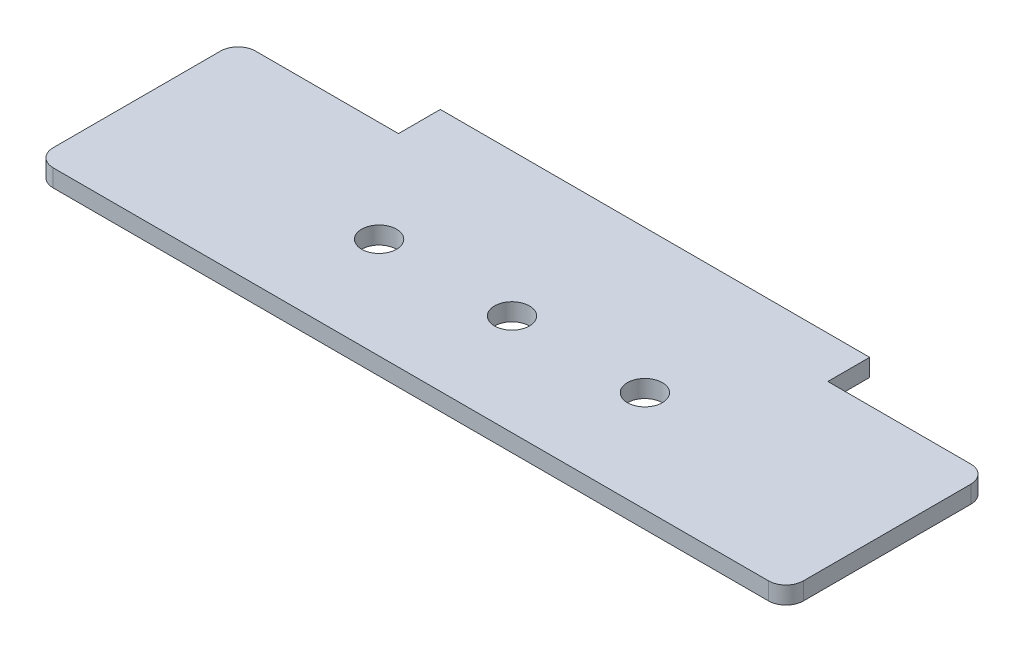
ISO-10303-21;
HEADER;
FILE_DESCRIPTION(('STEP AP214'),'2;1');
FILE_NAME('part.step','',(''),(''),'','','');
FILE_SCHEMA(('AUTOMOTIVE_DESIGN { 1 0 10303 214 1 1 1 1 }'));
ENDSEC;
DATA;
#1=APPLICATION_CONTEXT('core data for automotive mechanical design processes');
#2=APPLICATION_PROTOCOL_DEFINITION('international standard','automotive_design',2000,#1);
#3=PRODUCT_CONTEXT('',#1,'mechanical');
#4=PRODUCT('Part','Part','',(#3));
#5=PRODUCT_RELATED_PRODUCT_CATEGORY('part','',(#4));
#6=PRODUCT_DEFINITION_FORMATION('','',#4);
#7=PRODUCT_DEFINITION_CONTEXT('part definition',#1,'design');
#8=PRODUCT_DEFINITION('design','',#6,#7);
#9=PRODUCT_DEFINITION_SHAPE('','',#8);
#10=(LENGTH_UNIT() NAMED_UNIT(*) SI_UNIT(.MILLI.,.METRE.));
#11=(NAMED_UNIT(*) PLANE_ANGLE_UNIT() SI_UNIT($,.RADIAN.));
#12=(NAMED_UNIT(*) SI_UNIT($,.STERADIAN.) SOLID_ANGLE_UNIT());
#13=UNCERTAINTY_MEASURE_WITH_UNIT(LENGTH_MEASURE(1.E-05),#10,'distance_accuracy_value','');
#14=(GEOMETRIC_REPRESENTATION_CONTEXT(3) GLOBAL_UNCERTAINTY_ASSIGNED_CONTEXT((#13)) GLOBAL_UNIT_ASSIGNED_CONTEXT((#10,
#11,#12)) REPRESENTATION_CONTEXT('',''));
#15=CARTESIAN_POINT('',(0.,0.,0.));
#16=DIRECTION('',(0.,0.,1.));
#17=DIRECTION('',(1.,0.,0.));
#18=AXIS2_PLACEMENT_3D('',#15,#16,#17);
#19=CARTESIAN_POINT('',(-6.445,0.5,-2.39999999999999));
#20=DIRECTION('',(0.,1.,0.));
#21=DIRECTION('',(0.,0.,1.));
#22=AXIS2_PLACEMENT_3D('',#19,#20,#21);
#23=PLANE('',#22);
#24=CARTESIAN_POINT('',(3.81,0.5,0.));
#25=DIRECTION('',(0.,1.,0.));
#26=DIRECTION('',(0.,0.,1.));
#27=AXIS2_PLACEMENT_3D('',#24,#25,#26);
#28=CIRCLE('',#27,0.499999999999999);
#29=CARTESIAN_POINT('',(3.81,0.5,0.499999999999999));
#30=VERTEX_POINT('',#29);
#31=EDGE_CURVE('E327',#30,#30,#28,.T.);
#32=ORIENTED_EDGE('',*,*,#31,.F.);
#33=EDGE_LOOP('',(#32));
#34=FACE_BOUND('',#33,.T.);
#35=DIRECTION('',(0.,0.,1.));
#36=VECTOR('',#35,1.);
#37=CARTESIAN_POINT('',(-2.345,0.5,-4.1));
#38=LINE('',#37,#36);
#39=CARTESIAN_POINT('',(-2.345,0.5,-4.1));
#40=VERTEX_POINT('',#39);
#41=CARTESIAN_POINT('',(-2.345,0.5,-2.9));
#42=VERTEX_POINT('',#41);
#43=EDGE_CURVE('E200',#40,#42,#38,.T.);
#44=ORIENTED_EDGE('',*,*,#43,.T.);
#45=DIRECTION('',(-1.,0.,0.));
#46=VECTOR('',#45,1.);
#47=CARTESIAN_POINT('',(-6.445,0.5,-2.89999999999999));
#48=LINE('',#47,#46);
#49=CARTESIAN_POINT('',(-6.445,0.5,-2.89999999999999));
#50=VERTEX_POINT('',#49);
#51=EDGE_CURVE('E112',#42,#50,#48,.T.);
#52=ORIENTED_EDGE('',*,*,#51,.T.);
#53=CARTESIAN_POINT('',(-6.445,0.5,-2.39999999999999));
#54=DIRECTION('',(0.,1.,0.));
#55=DIRECTION('',(0.,0.,1.));
#56=AXIS2_PLACEMENT_3D('',#53,#54,#55);
#57=CIRCLE('',#56,0.5);
#58=CARTESIAN_POINT('',(-6.945,0.5,-2.39999999999999));
#59=VERTEX_POINT('',#58);
#60=EDGE_CURVE('E237',#50,#59,#57,.T.);
#61=ORIENTED_EDGE('',*,*,#60,.T.);
#62=DIRECTION('',(0.,0.,1.));
#63=VECTOR('',#62,1.);
#64=CARTESIAN_POINT('',(-6.945,0.5,-2.39999999999999));
#65=LINE('',#64,#63);
#66=CARTESIAN_POINT('',(-6.945,0.5,2.4));
#67=VERTEX_POINT('',#66);
#68=EDGE_CURVE('E257',#59,#67,#65,.T.);
#69=ORIENTED_EDGE('',*,*,#68,.T.);
#70=CARTESIAN_POINT('',(-6.445,0.5,2.4));
#71=DIRECTION('',(0.,1.,0.));
#72=DIRECTION('',(0.,0.,1.));
#73=AXIS2_PLACEMENT_3D('',#70,#71,#72);
#74=CIRCLE('',#73,0.499999999999999);
#75=CARTESIAN_POINT('',(-6.445,0.5,2.9));
#76=VERTEX_POINT('',#75);
#77=EDGE_CURVE('E253',#67,#76,#74,.T.);
#78=ORIENTED_EDGE('',*,*,#77,.T.);
#79=DIRECTION('',(1.,0.,0.));
#80=VECTOR('',#79,1.);
#81=CARTESIAN_POINT('',(-6.445,0.5,2.9));
#82=LINE('',#81,#80);
#83=CARTESIAN_POINT('',(14.065,0.5,2.9));
#84=VERTEX_POINT('',#83);
#85=EDGE_CURVE('E256',#76,#84,#82,.T.);
#86=ORIENTED_EDGE('',*,*,#85,.T.);
#87=CARTESIAN_POINT('',(14.065,0.5,2.4));
#88=DIRECTION('',(0.,1.,0.));
#89=DIRECTION('',(0.,0.,1.));
#90=AXIS2_PLACEMENT_3D('',#87,#88,#89);
#91=CIRCLE('',#90,0.5);
#92=CARTESIAN_POINT('',(14.565,0.5,2.4));
#93=VERTEX_POINT('',#92);
#94=EDGE_CURVE('E261',#84,#93,#91,.T.);
#95=ORIENTED_EDGE('',*,*,#94,.T.);
#96=DIRECTION('',(0.,0.,-1.));
#97=VECTOR('',#96,1.);
#98=CARTESIAN_POINT('',(14.565,0.5,-2.4));
#99=LINE('',#98,#97);
#100=CARTESIAN_POINT('',(14.565,0.5,-2.4));
#101=VERTEX_POINT('',#100);
#102=EDGE_CURVE('E268',#93,#101,#99,.T.);
#103=ORIENTED_EDGE('',*,*,#102,.T.);
#104=CARTESIAN_POINT('',(14.065,0.5,-2.4));
#105=DIRECTION('',(0.,1.,0.));
#106=DIRECTION('',(0.,0.,-1.));
#107=AXIS2_PLACEMENT_3D('',#104,#105,#106);
#108=CIRCLE('',#107,0.5);
#109=CARTESIAN_POINT('',(14.065,0.5,-2.9));
#110=VERTEX_POINT('',#109);
#111=EDGE_CURVE('E143',#101,#110,#108,.T.);
#112=ORIENTED_EDGE('',*,*,#111,.T.);
#113=DIRECTION('',(-1.,0.,0.));
#114=VECTOR('',#113,1.);
#115=CARTESIAN_POINT('',(9.965,0.5,-2.9));
#116=LINE('',#115,#114);
#117=CARTESIAN_POINT('',(9.965,0.5,-2.9));
#118=VERTEX_POINT('',#117);
#119=EDGE_CURVE('E137',#110,#118,#116,.T.);
#120=ORIENTED_EDGE('',*,*,#119,.T.);
#121=DIRECTION('',(0.,0.,-1.));
#122=VECTOR('',#121,1.);
#123=CARTESIAN_POINT('',(9.965,0.5,-4.1));
#124=LINE('',#123,#122);
#125=CARTESIAN_POINT('',(9.965,0.5,-4.1));
#126=VERTEX_POINT('',#125);
#127=EDGE_CURVE('E141',#118,#126,#124,.T.);
#128=ORIENTED_EDGE('',*,*,#127,.T.);
#129=DIRECTION('',(-1.,0.,0.));
#130=VECTOR('',#129,1.);
#131=CARTESIAN_POINT('',(-2.345,0.5,-4.1));
#132=LINE('',#131,#130);
#133=EDGE_CURVE('E57',#126,#40,#132,.T.);
#134=ORIENTED_EDGE('',*,*,#133,.T.);
#135=EDGE_LOOP('',(#44,#52,#61,#69,#78,#86,#95,#103,#112,#120,#128,#134));
#136=FACE_BOUND('',#135,.T.);
#137=CARTESIAN_POINT('',(0.,0.5,0.));
#138=DIRECTION('',(0.,1.,0.));
#139=DIRECTION('',(0.,0.,1.));
#140=AXIS2_PLACEMENT_3D('',#137,#138,#139);
#141=CIRCLE('',#140,0.499999999999999);
#142=CARTESIAN_POINT('',(0.,0.5,0.499999999999999));
#143=VERTEX_POINT('',#142);
#144=EDGE_CURVE('E170',#143,#143,#141,.T.);
#145=ORIENTED_EDGE('',*,*,#144,.F.);
#146=EDGE_LOOP('',(#145));
#147=FACE_BOUND('',#146,.T.);
#148=CARTESIAN_POINT('',(7.62000000000001,0.5,0.));
#149=DIRECTION('',(0.,1.,0.));
#150=DIRECTION('',(0.,0.,1.));
#151=AXIS2_PLACEMENT_3D('',#148,#149,#150);
#152=CIRCLE('',#151,0.499999999999999);
#153=CARTESIAN_POINT('',(7.62000000000001,0.5,0.499999999999999));
#154=VERTEX_POINT('',#153);
#155=EDGE_CURVE('E316',#154,#154,#152,.T.);
#156=ORIENTED_EDGE('',*,*,#155,.F.);
#157=EDGE_LOOP('',(#156));
#158=FACE_BOUND('',#157,.T.);
#159=ADVANCED_FACE('F39',(#34,#136,#147,#158),#23,.T.);
#160=CARTESIAN_POINT('',(-6.445,0.,-2.39999999999999));
#161=DIRECTION('',(0.,1.,0.));
#162=DIRECTION('',(0.,0.,1.));
#163=AXIS2_PLACEMENT_3D('',#160,#161,#162);
#164=PLANE('',#163);
#165=DIRECTION('',(0.,0.,1.));
#166=VECTOR('',#165,1.);
#167=CARTESIAN_POINT('',(-2.345,0.,-4.1));
#168=LINE('',#167,#166);
#169=CARTESIAN_POINT('',(-2.345,0.,-4.1));
#170=VERTEX_POINT('',#169);
#171=CARTESIAN_POINT('',(-2.345,0.,-2.9));
#172=VERTEX_POINT('',#171);
#173=EDGE_CURVE('E165',#170,#172,#168,.T.);
#174=ORIENTED_EDGE('',*,*,#173,.F.);
#175=DIRECTION('',(-1.,0.,0.));
#176=VECTOR('',#175,1.);
#177=CARTESIAN_POINT('',(-2.345,0.,-4.1));
#178=LINE('',#177,#176);
#179=CARTESIAN_POINT('',(9.965,0.,-4.1));
#180=VERTEX_POINT('',#179);
#181=EDGE_CURVE('E104',#180,#170,#178,.T.);
#182=ORIENTED_EDGE('',*,*,#181,.F.);
#183=DIRECTION('',(0.,0.,-1.));
#184=VECTOR('',#183,1.);
#185=CARTESIAN_POINT('',(9.965,0.,-4.1));
#186=LINE('',#185,#184);
#187=CARTESIAN_POINT('',(9.965,0.,-2.9));
#188=VERTEX_POINT('',#187);
#189=EDGE_CURVE('E98',#188,#180,#186,.T.);
#190=ORIENTED_EDGE('',*,*,#189,.F.);
#191=DIRECTION('',(-1.,0.,0.));
#192=VECTOR('',#191,1.);
#193=CARTESIAN_POINT('',(9.965,0.,-2.9));
#194=LINE('',#193,#192);
#195=CARTESIAN_POINT('',(14.065,0.,-2.9));
#196=VERTEX_POINT('',#195);
#197=EDGE_CURVE('E152',#196,#188,#194,.T.);
#198=ORIENTED_EDGE('',*,*,#197,.F.);
#199=CARTESIAN_POINT('',(14.065,0.,-2.4));
#200=DIRECTION('',(0.,1.,0.));
#201=DIRECTION('',(0.,0.,-1.));
#202=AXIS2_PLACEMENT_3D('',#199,#200,#201);
#203=CIRCLE('',#202,0.5);
#204=CARTESIAN_POINT('',(14.565,0.,-2.4));
#205=VERTEX_POINT('',#204);
#206=EDGE_CURVE('E191',#205,#196,#203,.T.);
#207=ORIENTED_EDGE('',*,*,#206,.F.);
#208=DIRECTION('',(0.,0.,-1.));
#209=VECTOR('',#208,1.);
#210=CARTESIAN_POINT('',(14.565,0.,-2.4));
#211=LINE('',#210,#209);
#212=CARTESIAN_POINT('',(14.565,0.,2.4));
#213=VERTEX_POINT('',#212);
#214=EDGE_CURVE('E188',#213,#205,#211,.T.);
#215=ORIENTED_EDGE('',*,*,#214,.F.);
#216=CARTESIAN_POINT('',(14.065,0.,2.4));
#217=DIRECTION('',(0.,1.,0.));
#218=DIRECTION('',(0.,0.,1.));
#219=AXIS2_PLACEMENT_3D('',#216,#217,#218);
#220=CIRCLE('',#219,0.5);
#221=CARTESIAN_POINT('',(14.065,0.,2.9));
#222=VERTEX_POINT('',#221);
#223=EDGE_CURVE('E185',#222,#213,#220,.T.);
#224=ORIENTED_EDGE('',*,*,#223,.F.);
#225=DIRECTION('',(1.,0.,0.));
#226=VECTOR('',#225,1.);
#227=CARTESIAN_POINT('',(-6.445,0.,2.9));
#228=LINE('',#227,#226);
#229=CARTESIAN_POINT('',(-6.445,0.,2.9));
#230=VERTEX_POINT('',#229);
#231=EDGE_CURVE('E182',#230,#222,#228,.T.);
#232=ORIENTED_EDGE('',*,*,#231,.F.);
#233=CARTESIAN_POINT('',(-6.445,0.,2.4));
#234=DIRECTION('',(0.,1.,0.));
#235=DIRECTION('',(0.,0.,1.));
#236=AXIS2_PLACEMENT_3D('',#233,#234,#235);
#237=CIRCLE('',#236,0.499999999999999);
#238=CARTESIAN_POINT('',(-6.945,0.,2.4));
#239=VERTEX_POINT('',#238);
#240=EDGE_CURVE('E179',#239,#230,#237,.T.);
#241=ORIENTED_EDGE('',*,*,#240,.F.);
#242=DIRECTION('',(0.,0.,1.));
#243=VECTOR('',#242,1.);
#244=CARTESIAN_POINT('',(-6.945,0.,-2.39999999999999));
#245=LINE('',#244,#243);
#246=CARTESIAN_POINT('',(-6.945,0.,-2.39999999999999));
#247=VERTEX_POINT('',#246);
#248=EDGE_CURVE('E176',#247,#239,#245,.T.);
#249=ORIENTED_EDGE('',*,*,#248,.F.);
#250=CARTESIAN_POINT('',(-6.445,0.,-2.39999999999999));
#251=DIRECTION('',(0.,1.,0.));
#252=DIRECTION('',(0.,0.,1.));
#253=AXIS2_PLACEMENT_3D('',#250,#251,#252);
#254=CIRCLE('',#253,0.5);
#255=CARTESIAN_POINT('',(-6.445,0.,-2.89999999999999));
#256=VERTEX_POINT('',#255);
#257=EDGE_CURVE('E173',#256,#247,#254,.T.);
#258=ORIENTED_EDGE('',*,*,#257,.F.);
#259=DIRECTION('',(-1.,0.,0.));
#260=VECTOR('',#259,1.);
#261=CARTESIAN_POINT('',(-6.445,0.,-2.89999999999999));
#262=LINE('',#261,#260);
#263=EDGE_CURVE('E169',#172,#256,#262,.T.);
#264=ORIENTED_EDGE('',*,*,#263,.F.);
#265=EDGE_LOOP('',(#174,#182,#190,#198,#207,#215,#224,#232,#241,#249,#258,#264));
#266=FACE_BOUND('',#265,.T.);
#267=CARTESIAN_POINT('',(0.,0.,0.));
#268=DIRECTION('',(0.,1.,0.));
#269=DIRECTION('',(0.,0.,1.));
#270=AXIS2_PLACEMENT_3D('',#267,#268,#269);
#271=CIRCLE('',#270,0.499999999999999);
#272=CARTESIAN_POINT('',(0.,0.,0.499999999999999));
#273=VERTEX_POINT('',#272);
#274=EDGE_CURVE('E331',#273,#273,#271,.T.);
#275=ORIENTED_EDGE('',*,*,#274,.T.);
#276=EDGE_LOOP('',(#275));
#277=FACE_BOUND('',#276,.T.);
#278=CARTESIAN_POINT('',(3.81,0.,0.));
#279=DIRECTION('',(0.,1.,0.));
#280=DIRECTION('',(0.,0.,1.));
#281=AXIS2_PLACEMENT_3D('',#278,#279,#280);
#282=CIRCLE('',#281,0.499999999999999);
#283=CARTESIAN_POINT('',(3.81,0.,0.499999999999999));
#284=VERTEX_POINT('',#283);
#285=EDGE_CURVE('E324',#284,#284,#282,.T.);
#286=ORIENTED_EDGE('',*,*,#285,.T.);
#287=EDGE_LOOP('',(#286));
#288=FACE_BOUND('',#287,.T.);
#289=CARTESIAN_POINT('',(7.62000000000001,0.,0.));
#290=DIRECTION('',(0.,1.,0.));
#291=DIRECTION('',(0.,0.,1.));
#292=AXIS2_PLACEMENT_3D('',#289,#290,#291);
#293=CIRCLE('',#292,0.499999999999999);
#294=CARTESIAN_POINT('',(7.62000000000001,0.,0.499999999999999));
#295=VERTEX_POINT('',#294);
#296=EDGE_CURVE('E319',#295,#295,#293,.T.);
#297=ORIENTED_EDGE('',*,*,#296,.T.);
#298=EDGE_LOOP('',(#297));
#299=FACE_BOUND('',#298,.T.);
#300=ADVANCED_FACE('F241',(#266,#277,#288,#299),#164,.F.);
#301=CARTESIAN_POINT('',(-2.345,0.5,-4.1));
#302=DIRECTION('',(1.,0.,0.));
#303=DIRECTION('',(0.,0.,-1.));
#304=AXIS2_PLACEMENT_3D('',#301,#302,#303);
#305=PLANE('',#304);
#306=ORIENTED_EDGE('',*,*,#173,.T.);
#307=DIRECTION('',(0.,-1.,0.));
#308=VECTOR('',#307,1.);
#309=CARTESIAN_POINT('',(-2.345,0.5,-2.9));
#310=LINE('',#309,#308);
#311=EDGE_CURVE('E11',#42,#172,#310,.T.);
#312=ORIENTED_EDGE('',*,*,#311,.F.);
#313=ORIENTED_EDGE('',*,*,#43,.F.);
#314=DIRECTION('',(0.,-1.,0.));
#315=VECTOR('',#314,1.);
#316=CARTESIAN_POINT('',(-2.345,0.5,-4.1));
#317=LINE('',#316,#315);
#318=EDGE_CURVE('E161',#40,#170,#317,.T.);
#319=ORIENTED_EDGE('',*,*,#318,.T.);
#320=EDGE_LOOP('',(#306,#312,#313,#319));
#321=FACE_BOUND('',#320,.T.);
#322=ADVANCED_FACE('F41',(#321),#305,.F.);
#323=CARTESIAN_POINT('',(-6.445,0.5,-2.89999999999999));
#324=DIRECTION('',(0.,0.,1.));
#325=DIRECTION('',(1.,0.,0.));
#326=AXIS2_PLACEMENT_3D('',#323,#324,#325);
#327=PLANE('',#326);
#328=ORIENTED_EDGE('',*,*,#263,.T.);
#329=DIRECTION('',(0.,-1.,0.));
#330=VECTOR('',#329,1.);
#331=CARTESIAN_POINT('',(-6.445,0.5,-2.89999999999999));
#332=LINE('',#331,#330);
#333=EDGE_CURVE('E49',#50,#256,#332,.T.);
#334=ORIENTED_EDGE('',*,*,#333,.F.);
#335=ORIENTED_EDGE('',*,*,#51,.F.);
#336=ORIENTED_EDGE('',*,*,#311,.T.);
#337=EDGE_LOOP('',(#328,#334,#335,#336));
#338=FACE_BOUND('',#337,.T.);
#339=ADVANCED_FACE('F439',(#338),#327,.F.);
#340=CARTESIAN_POINT('',(-6.445,0.5,-2.39999999999999));
#341=DIRECTION('',(0.,-1.,0.));
#342=DIRECTION('',(0.,0.,-1.));
#343=AXIS2_PLACEMENT_3D('',#340,#341,#342);
#344=CYLINDRICAL_SURFACE('',#343,0.5);
#345=ORIENTED_EDGE('',*,*,#257,.T.);
#346=DIRECTION('',(0.,-1.,0.));
#347=VECTOR('',#346,1.);
#348=CARTESIAN_POINT('',(-6.945,0.5,-2.39999999999999));
#349=LINE('',#348,#347);
#350=EDGE_CURVE('E227',#59,#247,#349,.T.);
#351=ORIENTED_EDGE('',*,*,#350,.F.);
#352=ORIENTED_EDGE('',*,*,#60,.F.);
#353=ORIENTED_EDGE('',*,*,#333,.T.);
#354=EDGE_LOOP('',(#345,#351,#352,#353));
#355=FACE_BOUND('',#354,.T.);
#356=ADVANCED_FACE('F235',(#355),#344,.T.);
#357=CARTESIAN_POINT('',(-6.945,0.5,-2.39999999999999));
#358=DIRECTION('',(1.,0.,0.));
#359=DIRECTION('',(0.,0.,-1.));
#360=AXIS2_PLACEMENT_3D('',#357,#358,#359);
#361=PLANE('',#360);
#362=ORIENTED_EDGE('',*,*,#248,.T.);
#363=DIRECTION('',(0.,-1.,0.));
#364=VECTOR('',#363,1.);
#365=CARTESIAN_POINT('',(-6.945,0.5,2.4));
#366=LINE('',#365,#364);
#367=EDGE_CURVE('E223',#67,#239,#366,.T.);
#368=ORIENTED_EDGE('',*,*,#367,.F.);
#369=ORIENTED_EDGE('',*,*,#68,.F.);
#370=ORIENTED_EDGE('',*,*,#350,.T.);
#371=EDGE_LOOP('',(#362,#368,#369,#370));
#372=FACE_BOUND('',#371,.T.);
#373=ADVANCED_FACE('F247',(#372),#361,.F.);
#374=CARTESIAN_POINT('',(-6.445,0.5,2.4));
#375=DIRECTION('',(0.,-1.,0.));
#376=DIRECTION('',(0.,0.,-1.));
#377=AXIS2_PLACEMENT_3D('',#374,#375,#376);
#378=CYLINDRICAL_SURFACE('',#377,0.499999999999999);
#379=ORIENTED_EDGE('',*,*,#240,.T.);
#380=DIRECTION('',(0.,-1.,0.));
#381=VECTOR('',#380,1.);
#382=CARTESIAN_POINT('',(-6.445,0.5,2.9));
#383=LINE('',#382,#381);
#384=EDGE_CURVE('E219',#76,#230,#383,.T.);
#385=ORIENTED_EDGE('',*,*,#384,.F.);
#386=ORIENTED_EDGE('',*,*,#77,.F.);
#387=ORIENTED_EDGE('',*,*,#367,.T.);
#388=EDGE_LOOP('',(#379,#385,#386,#387));
#389=FACE_BOUND('',#388,.T.);
#390=ADVANCED_FACE('F251',(#389),#378,.T.);
#391=CARTESIAN_POINT('',(-6.445,0.5,2.9));
#392=DIRECTION('',(0.,0.,-1.));
#393=DIRECTION('',(-1.,0.,0.));
#394=AXIS2_PLACEMENT_3D('',#391,#392,#393);
#395=PLANE('',#394);
#396=ORIENTED_EDGE('',*,*,#231,.T.);
#397=DIRECTION('',(0.,-1.,0.));
#398=VECTOR('',#397,1.);
#399=CARTESIAN_POINT('',(14.065,0.5,2.9));
#400=LINE('',#399,#398);
#401=EDGE_CURVE('E215',#84,#222,#400,.T.);
#402=ORIENTED_EDGE('',*,*,#401,.F.);
#403=ORIENTED_EDGE('',*,*,#85,.F.);
#404=ORIENTED_EDGE('',*,*,#384,.T.);
#405=EDGE_LOOP('',(#396,#402,#403,#404));
#406=FACE_BOUND('',#405,.T.);
#407=ADVANCED_FACE('F404',(#406),#395,.F.);
#408=CARTESIAN_POINT('',(14.065,0.5,2.4));
#409=DIRECTION('',(0.,-1.,0.));
#410=DIRECTION('',(0.,0.,-1.));
#411=AXIS2_PLACEMENT_3D('',#408,#409,#410);
#412=CYLINDRICAL_SURFACE('',#411,0.5);
#413=ORIENTED_EDGE('',*,*,#223,.T.);
#414=DIRECTION('',(0.,-1.,0.));
#415=VECTOR('',#414,1.);
#416=CARTESIAN_POINT('',(14.565,0.5,2.4));
#417=LINE('',#416,#415);
#418=EDGE_CURVE('E211',#93,#213,#417,.T.);
#419=ORIENTED_EDGE('',*,*,#418,.F.);
#420=ORIENTED_EDGE('',*,*,#94,.F.);
#421=ORIENTED_EDGE('',*,*,#401,.T.);
#422=EDGE_LOOP('',(#413,#419,#420,#421));
#423=FACE_BOUND('',#422,.T.);
#424=ADVANCED_FACE('F395',(#423),#412,.T.);
#425=CARTESIAN_POINT('',(14.565,0.5,-2.4));
#426=DIRECTION('',(-1.,0.,0.));
#427=DIRECTION('',(0.,0.,1.));
#428=AXIS2_PLACEMENT_3D('',#425,#426,#427);
#429=PLANE('',#428);
#430=ORIENTED_EDGE('',*,*,#214,.T.);
#431=DIRECTION('',(0.,-1.,0.));
#432=VECTOR('',#431,1.);
#433=CARTESIAN_POINT('',(14.565,0.5,-2.4));
#434=LINE('',#433,#432);
#435=EDGE_CURVE('E207',#101,#205,#434,.T.);
#436=ORIENTED_EDGE('',*,*,#435,.F.);
#437=ORIENTED_EDGE('',*,*,#102,.F.);
#438=ORIENTED_EDGE('',*,*,#418,.T.);
#439=EDGE_LOOP('',(#430,#436,#437,#438));
#440=FACE_BOUND('',#439,.T.);
#441=ADVANCED_FACE('F276',(#440),#429,.F.);
#442=CARTESIAN_POINT('',(14.065,0.5,-2.4));
#443=DIRECTION('',(0.,-1.,0.));
#444=DIRECTION('',(0.,0.,-1.));
#445=AXIS2_PLACEMENT_3D('',#442,#443,#444);
#446=CYLINDRICAL_SURFACE('',#445,0.5);
#447=ORIENTED_EDGE('',*,*,#206,.T.);
#448=DIRECTION('',(0.,-1.,0.));
#449=VECTOR('',#448,1.);
#450=CARTESIAN_POINT('',(14.065,0.5,-2.9));
#451=LINE('',#450,#449);
#452=EDGE_CURVE('E154',#110,#196,#451,.T.);
#453=ORIENTED_EDGE('',*,*,#452,.F.);
#454=ORIENTED_EDGE('',*,*,#111,.F.);
#455=ORIENTED_EDGE('',*,*,#435,.T.);
#456=EDGE_LOOP('',(#447,#453,#454,#455));
#457=FACE_BOUND('',#456,.T.);
#458=ADVANCED_FACE('F280',(#457),#446,.T.);
#459=CARTESIAN_POINT('',(9.965,0.5,-2.9));
#460=DIRECTION('',(0.,0.,1.));
#461=DIRECTION('',(1.,0.,0.));
#462=AXIS2_PLACEMENT_3D('',#459,#460,#461);
#463=PLANE('',#462);
#464=ORIENTED_EDGE('',*,*,#197,.T.);
#465=DIRECTION('',(0.,-1.,0.));
#466=VECTOR('',#465,1.);
#467=CARTESIAN_POINT('',(9.965,0.5,-2.9));
#468=LINE('',#467,#466);
#469=EDGE_CURVE('E149',#118,#188,#468,.T.);
#470=ORIENTED_EDGE('',*,*,#469,.F.);
#471=ORIENTED_EDGE('',*,*,#119,.F.);
#472=ORIENTED_EDGE('',*,*,#452,.T.);
#473=EDGE_LOOP('',(#464,#470,#471,#472));
#474=FACE_BOUND('',#473,.T.);
#475=ADVANCED_FACE('F150',(#474),#463,.F.);
#476=CARTESIAN_POINT('',(9.965,0.5,-4.1));
#477=DIRECTION('',(-1.,0.,0.));
#478=DIRECTION('',(0.,0.,1.));
#479=AXIS2_PLACEMENT_3D('',#476,#477,#478);
#480=PLANE('',#479);
#481=ORIENTED_EDGE('',*,*,#189,.T.);
#482=DIRECTION('',(0.,-1.,0.));
#483=VECTOR('',#482,1.);
#484=CARTESIAN_POINT('',(9.965,0.5,-4.1));
#485=LINE('',#484,#483);
#486=EDGE_CURVE('E155',#126,#180,#485,.T.);
#487=ORIENTED_EDGE('',*,*,#486,.F.);
#488=ORIENTED_EDGE('',*,*,#127,.F.);
#489=ORIENTED_EDGE('',*,*,#469,.T.);
#490=EDGE_LOOP('',(#481,#487,#488,#489));
#491=FACE_BOUND('',#490,.T.);
#492=ADVANCED_FACE('F157',(#491),#480,.F.);
#493=CARTESIAN_POINT('',(-2.345,0.5,-4.1));
#494=DIRECTION('',(0.,0.,1.));
#495=DIRECTION('',(1.,0.,0.));
#496=AXIS2_PLACEMENT_3D('',#493,#494,#495);
#497=PLANE('',#496);
#498=ORIENTED_EDGE('',*,*,#181,.T.);
#499=ORIENTED_EDGE('',*,*,#318,.F.);
#500=ORIENTED_EDGE('',*,*,#133,.F.);
#501=ORIENTED_EDGE('',*,*,#486,.T.);
#502=EDGE_LOOP('',(#498,#499,#500,#501));
#503=FACE_BOUND('',#502,.T.);
#504=ADVANCED_FACE('F284',(#503),#497,.F.);
#505=CARTESIAN_POINT('',(0.,0.5,0.));
#506=DIRECTION('',(0.,-1.,0.));
#507=DIRECTION('',(0.,0.,-1.));
#508=AXIS2_PLACEMENT_3D('',#505,#506,#507);
#509=CYLINDRICAL_SURFACE('',#508,0.499999999999999);
#510=ORIENTED_EDGE('',*,*,#144,.T.);
#511=EDGE_LOOP('',(#510));
#512=FACE_BOUND('',#511,.T.);
#513=ORIENTED_EDGE('',*,*,#274,.F.);
#514=EDGE_LOOP('',(#513));
#515=FACE_BOUND('',#514,.T.);
#516=ADVANCED_FACE('F286',(#512,#515),#509,.F.);
#517=CARTESIAN_POINT('',(3.81,0.5,0.));
#518=DIRECTION('',(0.,-1.,0.));
#519=DIRECTION('',(0.,0.,-1.));
#520=AXIS2_PLACEMENT_3D('',#517,#518,#519);
#521=CYLINDRICAL_SURFACE('',#520,0.499999999999999);
#522=ORIENTED_EDGE('',*,*,#31,.T.);
#523=EDGE_LOOP('',(#522));
#524=FACE_BOUND('',#523,.T.);
#525=ORIENTED_EDGE('',*,*,#285,.F.);
#526=EDGE_LOOP('',(#525));
#527=FACE_BOUND('',#526,.T.);
#528=ADVANCED_FACE('F292',(#524,#527),#521,.F.);
#529=CARTESIAN_POINT('',(7.62000000000001,0.5,0.));
#530=DIRECTION('',(0.,-1.,0.));
#531=DIRECTION('',(0.,0.,-1.));
#532=AXIS2_PLACEMENT_3D('',#529,#530,#531);
#533=CYLINDRICAL_SURFACE('',#532,0.499999999999999);
#534=ORIENTED_EDGE('',*,*,#155,.T.);
#535=EDGE_LOOP('',(#534));
#536=FACE_BOUND('',#535,.T.);
#537=ORIENTED_EDGE('',*,*,#296,.F.);
#538=EDGE_LOOP('',(#537));
#539=FACE_BOUND('',#538,.T.);
#540=ADVANCED_FACE('F307',(#536,#539),#533,.F.);
#541=CLOSED_SHELL('',(#159,#300,#322,#339,#356,#373,#390,#407,#424,#441,#458,#475,#492,#504,
#516,#528,#540));
#542=MANIFOLD_SOLID_BREP('B2',#541);
#543=ADVANCED_BREP_SHAPE_REPRESENTATION('',(#18,#542),#14);
#544=SHAPE_DEFINITION_REPRESENTATION(#9,#543);
ENDSEC;
END-ISO-10303-21;
